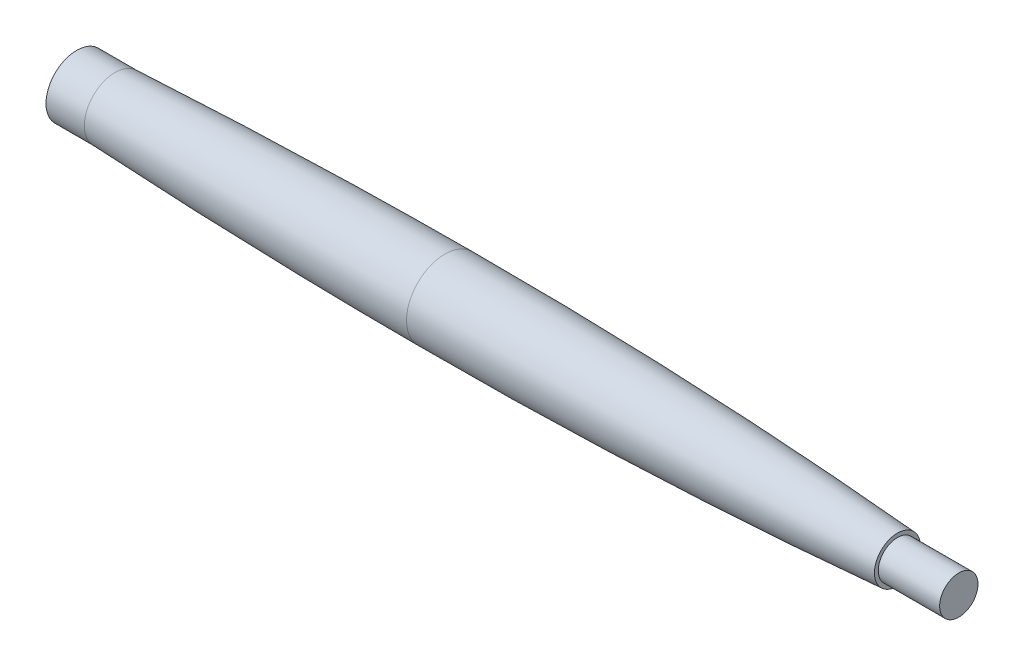
ISO-10303-21;
HEADER;
FILE_DESCRIPTION(('STEP AP214'),'2;1');
FILE_NAME('part.step','',(''),(''),'','','');
FILE_SCHEMA(('AUTOMOTIVE_DESIGN { 1 0 10303 214 1 1 1 1 }'));
ENDSEC;
DATA;
#1=APPLICATION_CONTEXT('core data for automotive mechanical design processes');
#2=APPLICATION_PROTOCOL_DEFINITION('international standard','automotive_design',2000,#1);
#3=PRODUCT_CONTEXT('',#1,'mechanical');
#4=PRODUCT('Part','Part','',(#3));
#5=PRODUCT_RELATED_PRODUCT_CATEGORY('part','',(#4));
#6=PRODUCT_DEFINITION_FORMATION('','',#4);
#7=PRODUCT_DEFINITION_CONTEXT('part definition',#1,'design');
#8=PRODUCT_DEFINITION('design','',#6,#7);
#9=PRODUCT_DEFINITION_SHAPE('','',#8);
#10=(LENGTH_UNIT() NAMED_UNIT(*) SI_UNIT(.MILLI.,.METRE.));
#11=(NAMED_UNIT(*) PLANE_ANGLE_UNIT() SI_UNIT($,.RADIAN.));
#12=(NAMED_UNIT(*) SI_UNIT($,.STERADIAN.) SOLID_ANGLE_UNIT());
#13=UNCERTAINTY_MEASURE_WITH_UNIT(LENGTH_MEASURE(1.E-05),#10,'distance_accuracy_value','');
#14=(GEOMETRIC_REPRESENTATION_CONTEXT(3) GLOBAL_UNCERTAINTY_ASSIGNED_CONTEXT((#13)) GLOBAL_UNIT_ASSIGNED_CONTEXT((#10,
#11,#12)) REPRESENTATION_CONTEXT('',''));
#15=CARTESIAN_POINT('',(0.,0.,0.));
#16=DIRECTION('',(0.,0.,1.));
#17=DIRECTION('',(1.,0.,0.));
#18=AXIS2_PLACEMENT_3D('',#15,#16,#17);
#19=CARTESIAN_POINT('',(-48.,0.,0.));
#20=DIRECTION('',(1.,0.,0.));
#21=DIRECTION('',(0.,0.,-1.));
#22=AXIS2_PLACEMENT_3D('',#19,#20,#21);
#23=CYLINDRICAL_SURFACE('',#22,4.);
#24=CARTESIAN_POINT('',(-48.,0.,0.));
#25=DIRECTION('',(-1.,0.,0.));
#26=DIRECTION('',(0.,0.,1.));
#27=AXIS2_PLACEMENT_3D('',#24,#25,#26);
#28=CIRCLE('',#27,4.);
#29=CARTESIAN_POINT('',(-48.,0.,4.));
#30=VERTEX_POINT('',#29);
#31=EDGE_CURVE('E11',#30,#30,#28,.T.);
#32=ORIENTED_EDGE('',*,*,#31,.F.);
#33=EDGE_LOOP('',(#32));
#34=FACE_BOUND('',#33,.T.);
#35=CARTESIAN_POINT('',(-43.,0.,0.));
#36=DIRECTION('',(-1.,0.,0.));
#37=DIRECTION('',(0.,0.,1.));
#38=AXIS2_PLACEMENT_3D('',#35,#36,#37);
#39=CIRCLE('',#38,4.);
#40=CARTESIAN_POINT('',(-43.,0.,4.));
#41=VERTEX_POINT('',#40);
#42=EDGE_CURVE('E46',#41,#41,#39,.T.);
#43=ORIENTED_EDGE('',*,*,#42,.T.);
#44=EDGE_LOOP('',(#43));
#45=FACE_BOUND('',#44,.T.);
#46=ADVANCED_FACE('F43',(#34,#45),#23,.T.);
#47=CARTESIAN_POINT('',(-48.,0.,0.));
#48=DIRECTION('',(-1.,0.,0.));
#49=DIRECTION('',(0.,0.,1.));
#50=AXIS2_PLACEMENT_3D('',#47,#48,#49);
#51=PLANE('',#50);
#52=ORIENTED_EDGE('',*,*,#31,.T.);
#53=EDGE_LOOP('',(#52));
#54=FACE_BOUND('',#53,.T.);
#55=ADVANCED_FACE('F58',(#54),#51,.T.);
#56=CARTESIAN_POINT('',(-43.,0.,0.));
#57=DIRECTION('',(-1.,0.,0.));
#58=DIRECTION('',(0.,0.,1.));
#59=AXIS2_PLACEMENT_3D('',#56,#57,#58);
#60=PLANE('',#59);
#61=ORIENTED_EDGE('',*,*,#42,.F.);
#62=EDGE_LOOP('',(#61));
#63=FACE_BOUND('',#62,.T.);
#64=ADVANCED_FACE('F56',(#63),#60,.F.);
#65=CLOSED_SHELL('',(#46,#55,#64));
#66=MANIFOLD_SOLID_BREP('B2',#65);
#67=CARTESIAN_POINT('',(-43.,4.,0.));
#68=DIRECTION('',(1.,0.,0.));
#69=DIRECTION('',(0.,0.,-1.));
#70=AXIS2_PLACEMENT_3D('',#67,#68,#69);
#71=PLANE('',#70);
#72=CARTESIAN_POINT('',(-43.,0.,0.));
#73=DIRECTION('',(-1.,0.,0.));
#74=DIRECTION('',(0.,0.,1.));
#75=AXIS2_PLACEMENT_3D('',#72,#73,#74);
#76=CIRCLE('',#75,4.);
#77=CARTESIAN_POINT('',(-43.,0.,4.));
#78=VERTEX_POINT('',#77);
#79=EDGE_CURVE('E93',#78,#78,#76,.T.);
#80=ORIENTED_EDGE('',*,*,#79,.T.);
#81=EDGE_LOOP('',(#80));
#82=FACE_BOUND('',#81,.T.);
#83=ADVANCED_FACE('F90',(#82),#71,.F.);
#84=CARTESIAN_POINT('',(2.20623616426668,0.,0.));
#85=DIRECTION('',(-1.,0.,0.));
#86=DIRECTION('',(0.,0.,1.));
#87=AXIS2_PLACEMENT_3D('',#84,#85,#86);
#88=DEGENERATE_TOROIDAL_SURFACE('',#87,1014.86815506352,1019.87054138782,.F.);
#89=ORIENTED_EDGE('',*,*,#79,.F.);
#90=EDGE_LOOP('',(#89));
#91=FACE_BOUND('',#90,.T.);
#92=CARTESIAN_POINT('',(0.,0.,0.));
#93=DIRECTION('',(-1.,0.,0.));
#94=DIRECTION('',(0.,0.,1.));
#95=AXIS2_PLACEMENT_3D('',#92,#93,#94);
#96=CIRCLE('',#95,5.00000000000012);
#97=CARTESIAN_POINT('',(0.,0.,5.00000000000012));
#98=VERTEX_POINT('',#97);
#99=EDGE_CURVE('E101',#98,#98,#96,.T.);
#100=ORIENTED_EDGE('',*,*,#99,.T.);
#101=EDGE_LOOP('',(#100));
#102=FACE_BOUND('',#101,.T.);
#103=ADVANCED_FACE('F110',(#91,#102),#88,.F.);
#104=CARTESIAN_POINT('',(1.7716756521362,0.,0.));
#105=DIRECTION('',(-1.,0.,0.));
#106=DIRECTION('',(0.,0.,1.));
#107=AXIS2_PLACEMENT_3D('',#104,#105,#106);
#108=DEGENERATE_TOROIDAL_SURFACE('',#107,813.985568261853,818.987484553828,.F.);
#109=ORIENTED_EDGE('',*,*,#99,.F.);
#110=EDGE_LOOP('',(#109));
#111=FACE_BOUND('',#110,.T.);
#112=CARTESIAN_POINT('',(59.,0.,0.));
#113=DIRECTION('',(-1.,0.,0.));
#114=DIRECTION('',(0.,0.,1.));
#115=AXIS2_PLACEMENT_3D('',#112,#113,#114);
#116=CIRCLE('',#115,2.99999999999989);
#117=CARTESIAN_POINT('',(59.,0.,2.99999999999989));
#118=VERTEX_POINT('',#117);
#119=EDGE_CURVE('E105',#118,#118,#116,.T.);
#120=ORIENTED_EDGE('',*,*,#119,.T.);
#121=EDGE_LOOP('',(#120));
#122=FACE_BOUND('',#121,.T.);
#123=ADVANCED_FACE('F112',(#111,#122),#108,.F.);
#124=CARTESIAN_POINT('',(59.,0.,0.));
#125=DIRECTION('',(-1.,0.,0.));
#126=DIRECTION('',(0.,0.,1.));
#127=AXIS2_PLACEMENT_3D('',#124,#125,#126);
#128=PLANE('',#127);
#129=CARTESIAN_POINT('',(59.,0.,0.));
#130=DIRECTION('',(1.,0.,0.));
#131=DIRECTION('',(0.,0.,-1.));
#132=AXIS2_PLACEMENT_3D('',#129,#130,#131);
#133=CIRCLE('',#132,2.5);
#134=CARTESIAN_POINT('',(59.,0.,-2.5));
#135=VERTEX_POINT('',#134);
#136=EDGE_CURVE('E42',#135,#135,#133,.T.);
#137=ORIENTED_EDGE('',*,*,#136,.F.);
#138=EDGE_LOOP('',(#137));
#139=FACE_BOUND('',#138,.T.);
#140=ORIENTED_EDGE('',*,*,#119,.F.);
#141=EDGE_LOOP('',(#140));
#142=FACE_BOUND('',#141,.T.);
#143=ADVANCED_FACE('F115',(#139,#142),#128,.F.);
#144=CARTESIAN_POINT('',(67.,0.,0.));
#145=DIRECTION('',(-1.,0.,0.));
#146=DIRECTION('',(0.,0.,1.));
#147=AXIS2_PLACEMENT_3D('',#144,#145,#146);
#148=CYLINDRICAL_SURFACE('',#147,2.5);
#149=CARTESIAN_POINT('',(67.,0.,0.));
#150=DIRECTION('',(1.,0.,0.));
#151=DIRECTION('',(0.,0.,-1.));
#152=AXIS2_PLACEMENT_3D('',#149,#150,#151);
#153=CIRCLE('',#152,2.5);
#154=CARTESIAN_POINT('',(67.,0.,-2.5));
#155=VERTEX_POINT('',#154);
#156=EDGE_CURVE('E104',#155,#155,#153,.T.);
#157=ORIENTED_EDGE('',*,*,#156,.F.);
#158=EDGE_LOOP('',(#157));
#159=FACE_BOUND('',#158,.T.);
#160=ORIENTED_EDGE('',*,*,#136,.T.);
#161=EDGE_LOOP('',(#160));
#162=FACE_BOUND('',#161,.T.);
#163=ADVANCED_FACE('F120',(#159,#162),#148,.T.);
#164=CARTESIAN_POINT('',(67.,0.,0.));
#165=DIRECTION('',(1.,0.,0.));
#166=DIRECTION('',(0.,0.,-1.));
#167=AXIS2_PLACEMENT_3D('',#164,#165,#166);
#168=PLANE('',#167);
#169=ORIENTED_EDGE('',*,*,#156,.T.);
#170=EDGE_LOOP('',(#169));
#171=FACE_BOUND('',#170,.T.);
#172=ADVANCED_FACE('F126',(#171),#168,.T.);
#173=CLOSED_SHELL('',(#83,#103,#123,#143,#163,#172));
#174=MANIFOLD_SOLID_BREP('B6',#173);
#175=ADVANCED_BREP_SHAPE_REPRESENTATION('',(#18,#66,#174),#14);
#176=SHAPE_DEFINITION_REPRESENTATION(#9,#175);
ENDSEC;
END-ISO-10303-21;
